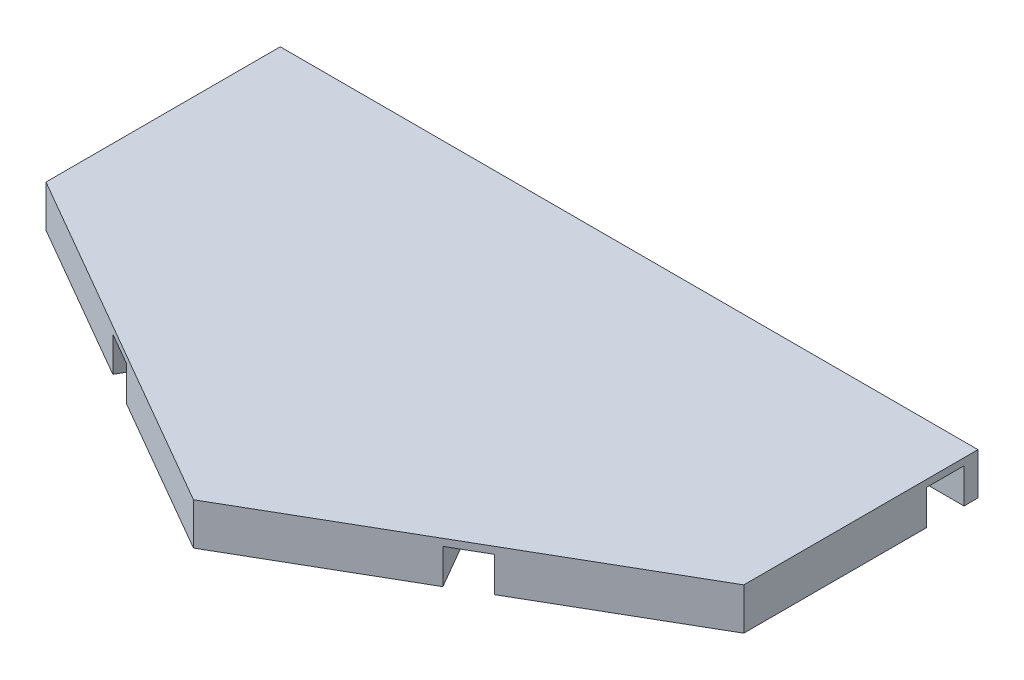
ISO-10303-21;
HEADER;
FILE_DESCRIPTION(('STEP AP214'),'2;1');
FILE_NAME('part.step','',(''),(''),'','','');
FILE_SCHEMA(('AUTOMOTIVE_DESIGN { 1 0 10303 214 1 1 1 1 }'));
ENDSEC;
DATA;
#1=APPLICATION_CONTEXT('core data for automotive mechanical design processes');
#2=APPLICATION_PROTOCOL_DEFINITION('international standard','automotive_design',2000,#1);
#3=PRODUCT_CONTEXT('',#1,'mechanical');
#4=PRODUCT('Part','Part','',(#3));
#5=PRODUCT_RELATED_PRODUCT_CATEGORY('part','',(#4));
#6=PRODUCT_DEFINITION_FORMATION('','',#4);
#7=PRODUCT_DEFINITION_CONTEXT('part definition',#1,'design');
#8=PRODUCT_DEFINITION('design','',#6,#7);
#9=PRODUCT_DEFINITION_SHAPE('','',#8);
#10=(LENGTH_UNIT() NAMED_UNIT(*) SI_UNIT(.MILLI.,.METRE.));
#11=(NAMED_UNIT(*) PLANE_ANGLE_UNIT() SI_UNIT($,.RADIAN.));
#12=(NAMED_UNIT(*) SI_UNIT($,.STERADIAN.) SOLID_ANGLE_UNIT());
#13=UNCERTAINTY_MEASURE_WITH_UNIT(LENGTH_MEASURE(1.E-05),#10,'distance_accuracy_value','');
#14=(GEOMETRIC_REPRESENTATION_CONTEXT(3) GLOBAL_UNCERTAINTY_ASSIGNED_CONTEXT((#13)) GLOBAL_UNIT_ASSIGNED_CONTEXT((#10,
#11,#12)) REPRESENTATION_CONTEXT('',''));
#15=CARTESIAN_POINT('',(0.,0.,0.));
#16=DIRECTION('',(0.,0.,1.));
#17=DIRECTION('',(1.,0.,0.));
#18=AXIS2_PLACEMENT_3D('',#15,#16,#17);
#19=CARTESIAN_POINT('',(0.,0.,0.));
#20=DIRECTION('',(0.,1.,0.));
#21=DIRECTION('',(0.,0.,1.));
#22=AXIS2_PLACEMENT_3D('',#19,#20,#21);
#23=PLANE('',#22);
#24=DIRECTION('',(1.,0.,0.));
#25=VECTOR('',#24,1.);
#26=CARTESIAN_POINT('',(-50.,0.,-4.7));
#27=LINE('',#26,#25);
#28=CARTESIAN_POINT('',(-50.,0.,-4.7));
#29=VERTEX_POINT('',#28);
#30=CARTESIAN_POINT('',(50.,0.,-4.7));
#31=VERTEX_POINT('',#30);
#32=EDGE_CURVE('E242',#29,#31,#27,.T.);
#33=ORIENTED_EDGE('',*,*,#32,.T.);
#34=DIRECTION('',(0.,0.,-1.));
#35=VECTOR('',#34,1.);
#36=CARTESIAN_POINT('',(50.,0.,0.));
#37=LINE('',#36,#35);
#38=CARTESIAN_POINT('',(50.,0.,-2.7));
#39=VERTEX_POINT('',#38);
#40=EDGE_CURVE('E251',#39,#31,#37,.T.);
#41=ORIENTED_EDGE('',*,*,#40,.F.);
#42=DIRECTION('',(-1.,0.,0.));
#43=VECTOR('',#42,1.);
#44=CARTESIAN_POINT('',(50.,0.,-2.7));
#45=LINE('',#44,#43);
#46=CARTESIAN_POINT('',(-50.,0.,-2.7));
#47=VERTEX_POINT('',#46);
#48=EDGE_CURVE('E392',#39,#47,#45,.T.);
#49=ORIENTED_EDGE('',*,*,#48,.T.);
#50=DIRECTION('',(0.,0.,1.));
#51=VECTOR('',#50,1.);
#52=CARTESIAN_POINT('',(-50.,0.,0.));
#53=LINE('',#52,#51);
#54=EDGE_CURVE('E143',#29,#47,#53,.T.);
#55=ORIENTED_EDGE('',*,*,#54,.F.);
#56=EDGE_LOOP('',(#33,#41,#49,#55));
#57=FACE_BOUND('',#56,.T.);
#58=ADVANCED_FACE('F120',(#57),#23,.F.);
#59=CARTESIAN_POINT('',(50.,6.,0.));
#60=DIRECTION('',(-1.,0.,0.));
#61=DIRECTION('',(0.,0.,1.));
#62=AXIS2_PLACEMENT_3D('',#59,#60,#61);
#63=PLANE('',#62);
#64=DIRECTION('',(0.,-1.,0.));
#65=VECTOR('',#64,1.);
#66=CARTESIAN_POINT('',(50.,160.280048396847,-4.7));
#67=LINE('',#66,#65);
#68=CARTESIAN_POINT('',(50.,6.00000000000001,-4.7));
#69=VERTEX_POINT('',#68);
#70=EDGE_CURVE('E235',#69,#31,#67,.T.);
#71=ORIENTED_EDGE('',*,*,#70,.F.);
#72=DIRECTION('',(0.,0.,-1.));
#73=VECTOR('',#72,1.);
#74=CARTESIAN_POINT('',(50.,6.,0.));
#75=LINE('',#74,#73);
#76=CARTESIAN_POINT('',(50.,6.,28.8675134594813));
#77=VERTEX_POINT('',#76);
#78=EDGE_CURVE('E248',#77,#69,#75,.T.);
#79=ORIENTED_EDGE('',*,*,#78,.F.);
#80=DIRECTION('',(0.,-1.,0.));
#81=VECTOR('',#80,1.);
#82=CARTESIAN_POINT('',(50.,6.,28.8675134594813));
#83=LINE('',#82,#81);
#84=CARTESIAN_POINT('',(50.,0.,28.8675134594813));
#85=VERTEX_POINT('',#84);
#86=EDGE_CURVE('E277',#77,#85,#83,.T.);
#87=ORIENTED_EDGE('',*,*,#86,.T.);
#88=CARTESIAN_POINT('',(50.,0.,2.7));
#89=VERTEX_POINT('',#88);
#90=EDGE_CURVE('E278',#85,#89,#37,.T.);
#91=ORIENTED_EDGE('',*,*,#90,.T.);
#92=DIRECTION('',(0.,-1.,0.));
#93=VECTOR('',#92,1.);
#94=CARTESIAN_POINT('',(50.,5.,2.7));
#95=LINE('',#94,#93);
#96=CARTESIAN_POINT('',(50.,5.,2.7));
#97=VERTEX_POINT('',#96);
#98=EDGE_CURVE('E318',#97,#89,#95,.T.);
#99=ORIENTED_EDGE('',*,*,#98,.F.);
#100=DIRECTION('',(0.,0.,-1.));
#101=VECTOR('',#100,1.);
#102=CARTESIAN_POINT('',(50.,5.,2.7));
#103=LINE('',#102,#101);
#104=CARTESIAN_POINT('',(50.,5.,-2.7));
#105=VERTEX_POINT('',#104);
#106=EDGE_CURVE('E384',#97,#105,#103,.T.);
#107=ORIENTED_EDGE('',*,*,#106,.T.);
#108=DIRECTION('',(0.,-1.,0.));
#109=VECTOR('',#108,1.);
#110=CARTESIAN_POINT('',(50.,5.,-2.7));
#111=LINE('',#110,#109);
#112=EDGE_CURVE('E387',#105,#39,#111,.T.);
#113=ORIENTED_EDGE('',*,*,#112,.T.);
#114=ORIENTED_EDGE('',*,*,#40,.T.);
#115=EDGE_LOOP('',(#71,#79,#87,#91,#99,#107,#113,#114));
#116=FACE_BOUND('',#115,.T.);
#117=ADVANCED_FACE('F122',(#116),#63,.F.);
#118=CARTESIAN_POINT('',(-50.,6.,0.));
#119=DIRECTION('',(1.,0.,0.));
#120=DIRECTION('',(0.,0.,-1.));
#121=AXIS2_PLACEMENT_3D('',#118,#119,#120);
#122=PLANE('',#121);
#123=DIRECTION('',(0.,-1.,0.));
#124=VECTOR('',#123,1.);
#125=CARTESIAN_POINT('',(-50.,160.280048396847,-4.7));
#126=LINE('',#125,#124);
#127=CARTESIAN_POINT('',(-50.,6.,-4.7));
#128=VERTEX_POINT('',#127);
#129=EDGE_CURVE('E136',#128,#29,#126,.T.);
#130=ORIENTED_EDGE('',*,*,#129,.T.);
#131=ORIENTED_EDGE('',*,*,#54,.T.);
#132=DIRECTION('',(0.,-1.,0.));
#133=VECTOR('',#132,1.);
#134=CARTESIAN_POINT('',(-50.,5.,-2.7));
#135=LINE('',#134,#133);
#136=CARTESIAN_POINT('',(-50.,5.,-2.7));
#137=VERTEX_POINT('',#136);
#138=EDGE_CURVE('E383',#137,#47,#135,.T.);
#139=ORIENTED_EDGE('',*,*,#138,.F.);
#140=DIRECTION('',(0.,0.,1.));
#141=VECTOR('',#140,1.);
#142=CARTESIAN_POINT('',(-50.,5.,-2.7));
#143=LINE('',#142,#141);
#144=CARTESIAN_POINT('',(-50.,5.,2.7));
#145=VERTEX_POINT('',#144);
#146=EDGE_CURVE('E407',#137,#145,#143,.T.);
#147=ORIENTED_EDGE('',*,*,#146,.T.);
#148=DIRECTION('',(0.,-1.,0.));
#149=VECTOR('',#148,1.);
#150=CARTESIAN_POINT('',(-50.,5.,2.7));
#151=LINE('',#150,#149);
#152=CARTESIAN_POINT('',(-50.,0.,2.7));
#153=VERTEX_POINT('',#152);
#154=EDGE_CURVE('E379',#145,#153,#151,.T.);
#155=ORIENTED_EDGE('',*,*,#154,.T.);
#156=CARTESIAN_POINT('',(-50.,0.,28.8675134594813));
#157=VERTEX_POINT('',#156);
#158=EDGE_CURVE('E282',#153,#157,#53,.T.);
#159=ORIENTED_EDGE('',*,*,#158,.T.);
#160=DIRECTION('',(0.,-1.,0.));
#161=VECTOR('',#160,1.);
#162=CARTESIAN_POINT('',(-50.,6.,28.8675134594813));
#163=LINE('',#162,#161);
#164=CARTESIAN_POINT('',(-50.,6.,28.8675134594813));
#165=VERTEX_POINT('',#164);
#166=EDGE_CURVE('E13',#165,#157,#163,.T.);
#167=ORIENTED_EDGE('',*,*,#166,.F.);
#168=DIRECTION('',(0.,0.,1.));
#169=VECTOR('',#168,1.);
#170=CARTESIAN_POINT('',(-50.,6.,0.));
#171=LINE('',#170,#169);
#172=EDGE_CURVE('E259',#128,#165,#171,.T.);
#173=ORIENTED_EDGE('',*,*,#172,.F.);
#174=EDGE_LOOP('',(#130,#131,#139,#147,#155,#159,#167,#173));
#175=FACE_BOUND('',#174,.T.);
#176=ADVANCED_FACE('F419',(#175),#122,.F.);
#177=CARTESIAN_POINT('',(0.,6.,0.));
#178=DIRECTION('',(0.,1.,0.));
#179=DIRECTION('',(0.,0.,1.));
#180=AXIS2_PLACEMENT_3D('',#177,#178,#179);
#181=PLANE('',#180);
#182=ORIENTED_EDGE('',*,*,#78,.T.);
#183=DIRECTION('',(1.,0.,0.));
#184=VECTOR('',#183,1.);
#185=CARTESIAN_POINT('',(-50.,6.00000000000001,-4.7));
#186=LINE('',#185,#184);
#187=EDGE_CURVE('E232',#128,#69,#186,.T.);
#188=ORIENTED_EDGE('',*,*,#187,.F.);
#189=ORIENTED_EDGE('',*,*,#172,.T.);
#190=DIRECTION('',(0.866025403784439,0.,0.5));
#191=VECTOR('',#190,1.);
#192=CARTESIAN_POINT('',(-25.,6.,43.3012701892219));
#193=LINE('',#192,#191);
#194=CARTESIAN_POINT('',(0.,6.,57.7350269189626));
#195=VERTEX_POINT('',#194);
#196=EDGE_CURVE('E264',#165,#195,#193,.T.);
#197=ORIENTED_EDGE('',*,*,#196,.T.);
#198=DIRECTION('',(0.866025403784439,0.,-0.499999999999999));
#199=VECTOR('',#198,1.);
#200=CARTESIAN_POINT('',(25.,6.,43.3012701892219));
#201=LINE('',#200,#199);
#202=EDGE_CURVE('E256',#195,#77,#201,.T.);
#203=ORIENTED_EDGE('',*,*,#202,.T.);
#204=EDGE_LOOP('',(#182,#188,#189,#197,#203));
#205=FACE_BOUND('',#204,.T.);
#206=ADVANCED_FACE('F254',(#205),#181,.T.);
#207=DIRECTION('',(0.5,0.,-0.866025403784439));
#208=VECTOR('',#207,1.);
#209=CARTESIAN_POINT('',(-22.661731409782,0.,44.6512701892219));
#210=LINE('',#209,#208);
#211=CARTESIAN_POINT('',(-22.661731409782,0.,44.6512701892219));
#212=VERTEX_POINT('',#211);
#213=CARTESIAN_POINT('',(0.,0.,5.39999999999996));
#214=VERTEX_POINT('',#213);
#215=EDGE_CURVE('E307',#212,#214,#210,.T.);
#216=ORIENTED_EDGE('',*,*,#215,.T.);
#217=DIRECTION('',(-0.5,0.,-0.866025403784439));
#218=VECTOR('',#217,1.);
#219=CARTESIAN_POINT('',(22.661731409782,0.,44.6512701892219));
#220=LINE('',#219,#218);
#221=CARTESIAN_POINT('',(22.661731409782,0.,44.6512701892219));
#222=VERTEX_POINT('',#221);
#223=EDGE_CURVE('E306',#222,#214,#220,.T.);
#224=ORIENTED_EDGE('',*,*,#223,.F.);
#225=DIRECTION('',(0.866025403784439,0.,-0.499999999999999));
#226=VECTOR('',#225,1.);
#227=CARTESIAN_POINT('',(25.,0.,43.3012701892219));
#228=LINE('',#227,#226);
#229=CARTESIAN_POINT('',(0.,0.,57.7350269189626));
#230=VERTEX_POINT('',#229);
#231=EDGE_CURVE('E260',#230,#222,#228,.T.);
#232=ORIENTED_EDGE('',*,*,#231,.F.);
#233=DIRECTION('',(0.866025403784439,0.,0.5));
#234=VECTOR('',#233,1.);
#235=CARTESIAN_POINT('',(-25.,0.,43.3012701892219));
#236=LINE('',#235,#234);
#237=EDGE_CURVE('E285',#212,#230,#236,.T.);
#238=ORIENTED_EDGE('',*,*,#237,.F.);
#239=EDGE_LOOP('',(#216,#224,#232,#238));
#240=FACE_BOUND('',#239,.T.);
#241=ADVANCED_FACE('F304',(#240),#23,.F.);
#242=DIRECTION('',(-0.5,0.,-0.866025403784439));
#243=VECTOR('',#242,1.);
#244=CARTESIAN_POINT('',(27.338268590218,0.,41.9512701892219));
#245=LINE('',#244,#243);
#246=CARTESIAN_POINT('',(27.338268590218,0.,41.9512701892219));
#247=VERTEX_POINT('',#246);
#248=CARTESIAN_POINT('',(4.67653718043599,0.,2.7));
#249=VERTEX_POINT('',#248);
#250=EDGE_CURVE('E310',#247,#249,#245,.T.);
#251=ORIENTED_EDGE('',*,*,#250,.T.);
#252=DIRECTION('',(-1.,0.,0.));
#253=VECTOR('',#252,1.);
#254=CARTESIAN_POINT('',(50.,0.,2.7));
#255=LINE('',#254,#253);
#256=EDGE_CURVE('E397',#89,#249,#255,.T.);
#257=ORIENTED_EDGE('',*,*,#256,.F.);
#258=ORIENTED_EDGE('',*,*,#90,.F.);
#259=EDGE_CURVE('E267',#247,#85,#228,.T.);
#260=ORIENTED_EDGE('',*,*,#259,.F.);
#261=EDGE_LOOP('',(#251,#257,#258,#260));
#262=FACE_BOUND('',#261,.T.);
#263=ADVANCED_FACE('F443',(#262),#23,.F.);
#264=CARTESIAN_POINT('',(-25.,6.,43.3012701892219));
#265=DIRECTION('',(0.5,0.,-0.866025403784438));
#266=DIRECTION('',(-0.866025403784439,0.,-0.5));
#267=AXIS2_PLACEMENT_3D('',#264,#265,#266);
#268=PLANE('',#267);
#269=CARTESIAN_POINT('',(-27.338268590218,0.,41.9512701892219));
#270=VERTEX_POINT('',#269);
#271=EDGE_CURVE('E286',#157,#270,#236,.T.);
#272=ORIENTED_EDGE('',*,*,#271,.T.);
#273=DIRECTION('',(0.,-1.,0.));
#274=VECTOR('',#273,1.);
#275=CARTESIAN_POINT('',(-27.338268590218,5.,41.9512701892219));
#276=LINE('',#275,#274);
#277=CARTESIAN_POINT('',(-27.338268590218,5.,41.9512701892219));
#278=VERTEX_POINT('',#277);
#279=EDGE_CURVE('E354',#278,#270,#276,.T.);
#280=ORIENTED_EDGE('',*,*,#279,.F.);
#281=DIRECTION('',(0.866025403784439,0.,0.499999999999999));
#282=VECTOR('',#281,1.);
#283=CARTESIAN_POINT('',(-27.338268590218,5.,41.9512701892219));
#284=LINE('',#283,#282);
#285=CARTESIAN_POINT('',(-22.661731409782,5.,44.6512701892219));
#286=VERTEX_POINT('',#285);
#287=EDGE_CURVE('E346',#278,#286,#284,.T.);
#288=ORIENTED_EDGE('',*,*,#287,.T.);
#289=DIRECTION('',(0.,-1.,0.));
#290=VECTOR('',#289,1.);
#291=CARTESIAN_POINT('',(-22.661731409782,5.,44.6512701892219));
#292=LINE('',#291,#290);
#293=EDGE_CURVE('E270',#286,#212,#292,.T.);
#294=ORIENTED_EDGE('',*,*,#293,.T.);
#295=ORIENTED_EDGE('',*,*,#237,.T.);
#296=DIRECTION('',(0.,-1.,0.));
#297=VECTOR('',#296,1.);
#298=CARTESIAN_POINT('',(0.,6.,57.7350269189626));
#299=LINE('',#298,#297);
#300=EDGE_CURVE('E129',#195,#230,#299,.T.);
#301=ORIENTED_EDGE('',*,*,#300,.F.);
#302=ORIENTED_EDGE('',*,*,#196,.F.);
#303=ORIENTED_EDGE('',*,*,#166,.T.);
#304=EDGE_LOOP('',(#272,#280,#288,#294,#295,#301,#302,#303));
#305=FACE_BOUND('',#304,.T.);
#306=ADVANCED_FACE('F363',(#305),#268,.F.);
#307=CARTESIAN_POINT('',(25.,6.,43.3012701892219));
#308=DIRECTION('',(-0.499999999999999,0.,-0.866025403784439));
#309=DIRECTION('',(-0.866025403784439,0.,0.499999999999999));
#310=AXIS2_PLACEMENT_3D('',#307,#308,#309);
#311=PLANE('',#310);
#312=ORIENTED_EDGE('',*,*,#231,.T.);
#313=DIRECTION('',(0.,-1.,0.));
#314=VECTOR('',#313,1.);
#315=CARTESIAN_POINT('',(22.661731409782,5.,44.6512701892219));
#316=LINE('',#315,#314);
#317=CARTESIAN_POINT('',(22.661731409782,5.,44.6512701892219));
#318=VERTEX_POINT('',#317);
#319=EDGE_CURVE('E324',#318,#222,#316,.T.);
#320=ORIENTED_EDGE('',*,*,#319,.F.);
#321=DIRECTION('',(0.866025403784439,0.,-0.499999999999999));
#322=VECTOR('',#321,1.);
#323=CARTESIAN_POINT('',(22.661731409782,5.,44.6512701892219));
#324=LINE('',#323,#322);
#325=CARTESIAN_POINT('',(27.338268590218,5.,41.9512701892219));
#326=VERTEX_POINT('',#325);
#327=EDGE_CURVE('E321',#318,#326,#324,.T.);
#328=ORIENTED_EDGE('',*,*,#327,.T.);
#329=DIRECTION('',(0.,-1.,0.));
#330=VECTOR('',#329,1.);
#331=CARTESIAN_POINT('',(27.338268590218,5.,41.9512701892219));
#332=LINE('',#331,#330);
#333=EDGE_CURVE('E328',#326,#247,#332,.T.);
#334=ORIENTED_EDGE('',*,*,#333,.T.);
#335=ORIENTED_EDGE('',*,*,#259,.T.);
#336=ORIENTED_EDGE('',*,*,#86,.F.);
#337=ORIENTED_EDGE('',*,*,#202,.F.);
#338=ORIENTED_EDGE('',*,*,#300,.T.);
#339=EDGE_LOOP('',(#312,#320,#328,#334,#335,#336,#337,#338));
#340=FACE_BOUND('',#339,.T.);
#341=ADVANCED_FACE('F296',(#340),#311,.F.);
#342=CARTESIAN_POINT('',(-4.67653718043599,0.,2.7));
#343=VERTEX_POINT('',#342);
#344=EDGE_CURVE('E241',#343,#153,#255,.T.);
#345=ORIENTED_EDGE('',*,*,#344,.F.);
#346=DIRECTION('',(0.5,0.,-0.866025403784439));
#347=VECTOR('',#346,1.);
#348=CARTESIAN_POINT('',(-27.338268590218,0.,41.9512701892219));
#349=LINE('',#348,#347);
#350=EDGE_CURVE('E338',#270,#343,#349,.T.);
#351=ORIENTED_EDGE('',*,*,#350,.F.);
#352=ORIENTED_EDGE('',*,*,#271,.F.);
#353=ORIENTED_EDGE('',*,*,#158,.F.);
#354=EDGE_LOOP('',(#345,#351,#352,#353));
#355=FACE_BOUND('',#354,.T.);
#356=ADVANCED_FACE('F425',(#355),#23,.F.);
#357=CARTESIAN_POINT('',(-27.338268590218,5.,41.9512701892219));
#358=DIRECTION('',(-0.866025403784439,0.,-0.5));
#359=DIRECTION('',(-0.5,0.,0.866025403784439));
#360=AXIS2_PLACEMENT_3D('',#357,#358,#359);
#361=PLANE('',#360);
#362=DIRECTION('',(0.,1.,0.));
#363=VECTOR('',#362,1.);
#364=CARTESIAN_POINT('',(-4.67653718043599,5.,2.7));
#365=LINE('',#364,#363);
#366=CARTESIAN_POINT('',(-4.67653718043599,5.,2.7));
#367=VERTEX_POINT('',#366);
#368=EDGE_CURVE('E327',#343,#367,#365,.T.);
#369=ORIENTED_EDGE('',*,*,#368,.T.);
#370=DIRECTION('',(0.5,0.,-0.866025403784439));
#371=VECTOR('',#370,1.);
#372=CARTESIAN_POINT('',(-27.338268590218,5.,41.9512701892219));
#373=LINE('',#372,#371);
#374=EDGE_CURVE('E339',#278,#367,#373,.T.);
#375=ORIENTED_EDGE('',*,*,#374,.F.);
#376=ORIENTED_EDGE('',*,*,#279,.T.);
#377=ORIENTED_EDGE('',*,*,#350,.T.);
#378=EDGE_LOOP('',(#369,#375,#376,#377));
#379=FACE_BOUND('',#378,.T.);
#380=ADVANCED_FACE('F426',(#379),#361,.F.);
#381=CARTESIAN_POINT('',(-22.661731409782,5.,44.6512701892219));
#382=DIRECTION('',(-0.866025403784439,0.,-0.5));
#383=DIRECTION('',(-0.5,0.,0.866025403784439));
#384=AXIS2_PLACEMENT_3D('',#381,#382,#383);
#385=PLANE('',#384);
#386=ORIENTED_EDGE('',*,*,#215,.F.);
#387=ORIENTED_EDGE('',*,*,#293,.F.);
#388=DIRECTION('',(0.5,0.,-0.866025403784439));
#389=VECTOR('',#388,1.);
#390=CARTESIAN_POINT('',(-22.661731409782,5.,44.6512701892219));
#391=LINE('',#390,#389);
#392=CARTESIAN_POINT('',(0.,5.,5.39999999999996));
#393=VERTEX_POINT('',#392);
#394=EDGE_CURVE('E342',#286,#393,#391,.T.);
#395=ORIENTED_EDGE('',*,*,#394,.T.);
#396=DIRECTION('',(0.,1.,0.));
#397=VECTOR('',#396,1.);
#398=CARTESIAN_POINT('',(0.,5.,5.39999999999995));
#399=LINE('',#398,#397);
#400=EDGE_CURVE('E335',#214,#393,#399,.T.);
#401=ORIENTED_EDGE('',*,*,#400,.F.);
#402=EDGE_LOOP('',(#386,#387,#395,#401));
#403=FACE_BOUND('',#402,.T.);
#404=ADVANCED_FACE('F366',(#403),#385,.T.);
#405=CARTESIAN_POINT('',(0.,5.,0.));
#406=DIRECTION('',(0.,1.,0.));
#407=DIRECTION('',(-1.,0.,0.));
#408=AXIS2_PLACEMENT_3D('',#405,#406,#407);
#409=PLANE('',#408);
#410=ORIENTED_EDGE('',*,*,#394,.F.);
#411=ORIENTED_EDGE('',*,*,#287,.F.);
#412=ORIENTED_EDGE('',*,*,#374,.T.);
#413=DIRECTION('',(-1.,0.,0.));
#414=VECTOR('',#413,1.);
#415=CARTESIAN_POINT('',(50.,5.,2.7));
#416=LINE('',#415,#414);
#417=EDGE_CURVE('E396',#367,#145,#416,.T.);
#418=ORIENTED_EDGE('',*,*,#417,.T.);
#419=ORIENTED_EDGE('',*,*,#146,.F.);
#420=DIRECTION('',(-1.,0.,0.));
#421=VECTOR('',#420,1.);
#422=CARTESIAN_POINT('',(50.,5.,-2.7));
#423=LINE('',#422,#421);
#424=EDGE_CURVE('E404',#105,#137,#423,.T.);
#425=ORIENTED_EDGE('',*,*,#424,.F.);
#426=ORIENTED_EDGE('',*,*,#106,.F.);
#427=CARTESIAN_POINT('',(4.67653718043599,5.,2.7));
#428=VERTEX_POINT('',#427);
#429=EDGE_CURVE('E411',#97,#428,#416,.T.);
#430=ORIENTED_EDGE('',*,*,#429,.T.);
#431=DIRECTION('',(-0.5,0.,-0.866025403784439));
#432=VECTOR('',#431,1.);
#433=CARTESIAN_POINT('',(27.338268590218,5.,41.9512701892219));
#434=LINE('',#433,#432);
#435=EDGE_CURVE('E374',#326,#428,#434,.T.);
#436=ORIENTED_EDGE('',*,*,#435,.F.);
#437=ORIENTED_EDGE('',*,*,#327,.F.);
#438=DIRECTION('',(-0.5,0.,-0.866025403784439));
#439=VECTOR('',#438,1.);
#440=CARTESIAN_POINT('',(22.661731409782,5.,44.6512701892219));
#441=LINE('',#440,#439);
#442=EDGE_CURVE('E316',#318,#393,#441,.T.);
#443=ORIENTED_EDGE('',*,*,#442,.T.);
#444=EDGE_LOOP('',(#410,#411,#412,#418,#419,#425,#426,#430,#436,#437,#443));
#445=FACE_BOUND('',#444,.T.);
#446=ADVANCED_FACE('F369',(#445),#409,.F.);
#447=CARTESIAN_POINT('',(22.661731409782,5.,44.6512701892219));
#448=DIRECTION('',(-0.866025403784439,0.,0.5));
#449=DIRECTION('',(0.5,0.,0.866025403784439));
#450=AXIS2_PLACEMENT_3D('',#447,#448,#449);
#451=PLANE('',#450);
#452=ORIENTED_EDGE('',*,*,#400,.T.);
#453=ORIENTED_EDGE('',*,*,#442,.F.);
#454=ORIENTED_EDGE('',*,*,#319,.T.);
#455=ORIENTED_EDGE('',*,*,#223,.T.);
#456=EDGE_LOOP('',(#452,#453,#454,#455));
#457=FACE_BOUND('',#456,.T.);
#458=ADVANCED_FACE('F448',(#457),#451,.F.);
#459=CARTESIAN_POINT('',(27.338268590218,5.,41.9512701892219));
#460=DIRECTION('',(-0.866025403784439,0.,0.5));
#461=DIRECTION('',(0.5,0.,0.866025403784439));
#462=AXIS2_PLACEMENT_3D('',#459,#460,#461);
#463=PLANE('',#462);
#464=ORIENTED_EDGE('',*,*,#250,.F.);
#465=ORIENTED_EDGE('',*,*,#333,.F.);
#466=ORIENTED_EDGE('',*,*,#435,.T.);
#467=DIRECTION('',(0.,1.,0.));
#468=VECTOR('',#467,1.);
#469=CARTESIAN_POINT('',(4.67653718043599,5.,2.7));
#470=LINE('',#469,#468);
#471=EDGE_CURVE('E311',#249,#428,#470,.T.);
#472=ORIENTED_EDGE('',*,*,#471,.F.);
#473=EDGE_LOOP('',(#464,#465,#466,#472));
#474=FACE_BOUND('',#473,.T.);
#475=ADVANCED_FACE('F446',(#474),#463,.T.);
#476=CARTESIAN_POINT('',(50.,5.,2.7));
#477=DIRECTION('',(0.,0.,1.));
#478=DIRECTION('',(1.,0.,0.));
#479=AXIS2_PLACEMENT_3D('',#476,#477,#478);
#480=PLANE('',#479);
#481=ORIENTED_EDGE('',*,*,#471,.T.);
#482=ORIENTED_EDGE('',*,*,#429,.F.);
#483=ORIENTED_EDGE('',*,*,#98,.T.);
#484=ORIENTED_EDGE('',*,*,#256,.T.);
#485=EDGE_LOOP('',(#481,#482,#483,#484));
#486=FACE_BOUND('',#485,.T.);
#487=ADVANCED_FACE('F441',(#486),#480,.F.);
#488=ORIENTED_EDGE('',*,*,#344,.T.);
#489=ORIENTED_EDGE('',*,*,#154,.F.);
#490=ORIENTED_EDGE('',*,*,#417,.F.);
#491=ORIENTED_EDGE('',*,*,#368,.F.);
#492=EDGE_LOOP('',(#488,#489,#490,#491));
#493=FACE_BOUND('',#492,.T.);
#494=ADVANCED_FACE('F430',(#493),#480,.F.);
#495=CARTESIAN_POINT('',(50.,5.,-2.7));
#496=DIRECTION('',(0.,0.,1.));
#497=DIRECTION('',(1.,0.,0.));
#498=AXIS2_PLACEMENT_3D('',#495,#496,#497);
#499=PLANE('',#498);
#500=ORIENTED_EDGE('',*,*,#48,.F.);
#501=ORIENTED_EDGE('',*,*,#112,.F.);
#502=ORIENTED_EDGE('',*,*,#424,.T.);
#503=ORIENTED_EDGE('',*,*,#138,.T.);
#504=EDGE_LOOP('',(#500,#501,#502,#503));
#505=FACE_BOUND('',#504,.T.);
#506=ADVANCED_FACE('F525',(#505),#499,.T.);
#507=CARTESIAN_POINT('',(-50.,160.280048396847,-4.7));
#508=DIRECTION('',(0.,0.,-1.));
#509=DIRECTION('',(-1.,0.,0.));
#510=AXIS2_PLACEMENT_3D('',#507,#508,#509);
#511=PLANE('',#510);
#512=ORIENTED_EDGE('',*,*,#187,.T.);
#513=ORIENTED_EDGE('',*,*,#70,.T.);
#514=ORIENTED_EDGE('',*,*,#32,.F.);
#515=ORIENTED_EDGE('',*,*,#129,.F.);
#516=EDGE_LOOP('',(#512,#513,#514,#515));
#517=FACE_BOUND('',#516,.T.);
#518=ADVANCED_FACE('F234',(#517),#511,.T.);
#519=CLOSED_SHELL('',(#58,#117,#176,#206,#241,#263,#306,#341,#356,#380,#404,#446,#458,#475,#487,
#494,#506,#518));
#520=MANIFOLD_SOLID_BREP('B2',#519);
#521=ADVANCED_BREP_SHAPE_REPRESENTATION('',(#18,#520),#14);
#522=SHAPE_DEFINITION_REPRESENTATION(#9,#521);
ENDSEC;
END-ISO-10303-21;
